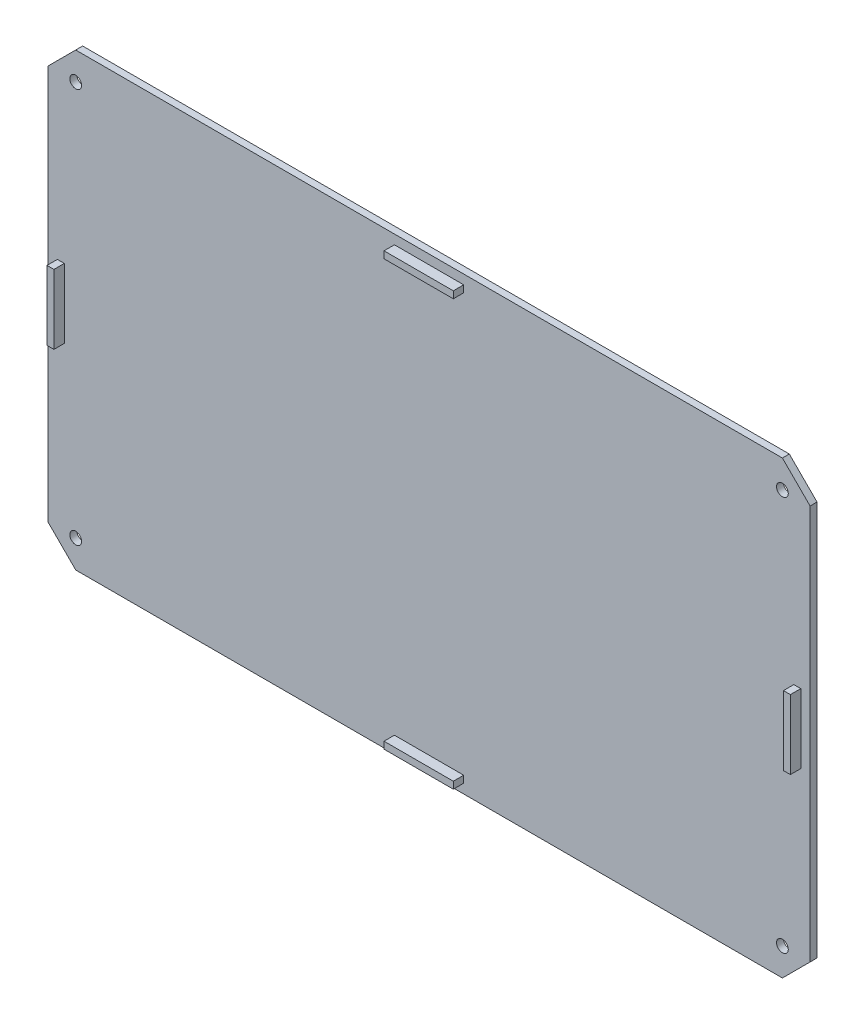
ISO-10303-21;
HEADER;
FILE_DESCRIPTION(('STEP AP214'),'2;1');
FILE_NAME('part.step','',(''),(''),'','','');
FILE_SCHEMA(('AUTOMOTIVE_DESIGN { 1 0 10303 214 1 1 1 1 }'));
ENDSEC;
DATA;
#1=APPLICATION_CONTEXT('core data for automotive mechanical design processes');
#2=APPLICATION_PROTOCOL_DEFINITION('international standard','automotive_design',2000,#1);
#3=PRODUCT_CONTEXT('',#1,'mechanical');
#4=PRODUCT('Part','Part','',(#3));
#5=PRODUCT_RELATED_PRODUCT_CATEGORY('part','',(#4));
#6=PRODUCT_DEFINITION_FORMATION('','',#4);
#7=PRODUCT_DEFINITION_CONTEXT('part definition',#1,'design');
#8=PRODUCT_DEFINITION('design','',#6,#7);
#9=PRODUCT_DEFINITION_SHAPE('','',#8);
#10=(LENGTH_UNIT() NAMED_UNIT(*) SI_UNIT(.MILLI.,.METRE.));
#11=(NAMED_UNIT(*) PLANE_ANGLE_UNIT() SI_UNIT($,.RADIAN.));
#12=(NAMED_UNIT(*) SI_UNIT($,.STERADIAN.) SOLID_ANGLE_UNIT());
#13=UNCERTAINTY_MEASURE_WITH_UNIT(LENGTH_MEASURE(1.E-05),#10,'distance_accuracy_value','');
#14=(GEOMETRIC_REPRESENTATION_CONTEXT(3) GLOBAL_UNCERTAINTY_ASSIGNED_CONTEXT((#13)) GLOBAL_UNIT_ASSIGNED_CONTEXT((#10,
#11,#12)) REPRESENTATION_CONTEXT('',''));
#15=CARTESIAN_POINT('',(0.,0.,0.));
#16=DIRECTION('',(0.,0.,1.));
#17=DIRECTION('',(1.,0.,0.));
#18=AXIS2_PLACEMENT_3D('',#15,#16,#17);
#19=CARTESIAN_POINT('',(0.,0.,2.));
#20=DIRECTION('',(0.,0.,1.));
#21=DIRECTION('',(1.,0.,0.));
#22=AXIS2_PLACEMENT_3D('',#19,#20,#21);
#23=PLANE('',#22);
#24=CARTESIAN_POINT('',(102.,57.,2.));
#25=DIRECTION('',(0.,0.,1.));
#26=DIRECTION('',(1.,0.,0.));
#27=AXIS2_PLACEMENT_3D('',#24,#25,#26);
#28=CIRCLE('',#27,1.7);
#29=CARTESIAN_POINT('',(103.7,57.,2.));
#30=VERTEX_POINT('',#29);
#31=EDGE_CURVE('E381',#30,#30,#28,.F.);
#32=ORIENTED_EDGE('',*,*,#31,.T.);
#33=EDGE_LOOP('',(#32));
#34=FACE_BOUND('',#33,.T.);
#35=CARTESIAN_POINT('',(102.,-57.,2.));
#36=DIRECTION('',(0.,0.,1.));
#37=DIRECTION('',(1.,0.,0.));
#38=AXIS2_PLACEMENT_3D('',#35,#36,#37);
#39=CIRCLE('',#38,1.7);
#40=CARTESIAN_POINT('',(103.7,-57.,2.));
#41=VERTEX_POINT('',#40);
#42=EDGE_CURVE('E378',#41,#41,#39,.F.);
#43=ORIENTED_EDGE('',*,*,#42,.T.);
#44=EDGE_LOOP('',(#43));
#45=FACE_BOUND('',#44,.T.);
#46=CARTESIAN_POINT('',(-102.,57.,2.));
#47=DIRECTION('',(0.,0.,1.));
#48=DIRECTION('',(1.,0.,0.));
#49=AXIS2_PLACEMENT_3D('',#46,#47,#48);
#50=CIRCLE('',#49,1.7);
#51=CARTESIAN_POINT('',(-100.3,57.,2.));
#52=VERTEX_POINT('',#51);
#53=EDGE_CURVE('E375',#52,#52,#50,.F.);
#54=ORIENTED_EDGE('',*,*,#53,.T.);
#55=EDGE_LOOP('',(#54));
#56=FACE_BOUND('',#55,.T.);
#57=CARTESIAN_POINT('',(-102.,-57.,2.));
#58=DIRECTION('',(0.,0.,1.));
#59=DIRECTION('',(1.,0.,0.));
#60=AXIS2_PLACEMENT_3D('',#57,#58,#59);
#61=CIRCLE('',#60,1.7);
#62=CARTESIAN_POINT('',(-100.3,-57.,2.));
#63=VERTEX_POINT('',#62);
#64=EDGE_CURVE('E374',#63,#63,#61,.F.);
#65=ORIENTED_EDGE('',*,*,#64,.T.);
#66=EDGE_LOOP('',(#65));
#67=FACE_BOUND('',#66,.T.);
#68=DIRECTION('',(0.707106781186544,-0.707106781186551,0.));
#69=VECTOR('',#68,1.);
#70=CARTESIAN_POINT('',(-110.,-57.,2.));
#71=LINE('',#70,#69);
#72=CARTESIAN_POINT('',(-110.,-57.,2.));
#73=VERTEX_POINT('',#72);
#74=CARTESIAN_POINT('',(-102.,-65.,2.));
#75=VERTEX_POINT('',#74);
#76=EDGE_CURVE('E318',#73,#75,#71,.T.);
#77=ORIENTED_EDGE('',*,*,#76,.T.);
#78=DIRECTION('',(1.,0.,0.));
#79=VECTOR('',#78,1.);
#80=CARTESIAN_POINT('',(-102.,-65.,2.));
#81=LINE('',#80,#79);
#82=CARTESIAN_POINT('',(102.,-65.,2.));
#83=VERTEX_POINT('',#82);
#84=EDGE_CURVE('E321',#75,#83,#81,.T.);
#85=ORIENTED_EDGE('',*,*,#84,.T.);
#86=DIRECTION('',(0.707106781186546,0.707106781186549,0.));
#87=VECTOR('',#86,1.);
#88=CARTESIAN_POINT('',(102.,-65.,2.));
#89=LINE('',#88,#87);
#90=CARTESIAN_POINT('',(110.,-57.,2.));
#91=VERTEX_POINT('',#90);
#92=EDGE_CURVE('E324',#83,#91,#89,.T.);
#93=ORIENTED_EDGE('',*,*,#92,.T.);
#94=DIRECTION('',(0.,1.,0.));
#95=VECTOR('',#94,1.);
#96=CARTESIAN_POINT('',(110.,-57.,2.));
#97=LINE('',#96,#95);
#98=CARTESIAN_POINT('',(110.,57.,2.));
#99=VERTEX_POINT('',#98);
#100=EDGE_CURVE('E326',#91,#99,#97,.T.);
#101=ORIENTED_EDGE('',*,*,#100,.T.);
#102=DIRECTION('',(-0.707106781186548,0.707106781186547,0.));
#103=VECTOR('',#102,1.);
#104=CARTESIAN_POINT('',(110.,57.,2.));
#105=LINE('',#104,#103);
#106=CARTESIAN_POINT('',(102.,65.,2.));
#107=VERTEX_POINT('',#106);
#108=EDGE_CURVE('E328',#99,#107,#105,.T.);
#109=ORIENTED_EDGE('',*,*,#108,.T.);
#110=DIRECTION('',(-1.,0.,0.));
#111=VECTOR('',#110,1.);
#112=CARTESIAN_POINT('',(102.,65.,2.));
#113=LINE('',#112,#111);
#114=CARTESIAN_POINT('',(-102.,65.,2.));
#115=VERTEX_POINT('',#114);
#116=EDGE_CURVE('E330',#107,#115,#113,.T.);
#117=ORIENTED_EDGE('',*,*,#116,.T.);
#118=DIRECTION('',(-0.707106781186547,-0.707106781186548,0.));
#119=VECTOR('',#118,1.);
#120=CARTESIAN_POINT('',(-102.,65.,2.));
#121=LINE('',#120,#119);
#122=CARTESIAN_POINT('',(-110.,57.,2.));
#123=VERTEX_POINT('',#122);
#124=EDGE_CURVE('E332',#115,#123,#121,.T.);
#125=ORIENTED_EDGE('',*,*,#124,.T.);
#126=DIRECTION('',(0.,-1.,0.));
#127=VECTOR('',#126,1.);
#128=CARTESIAN_POINT('',(-110.,57.,2.));
#129=LINE('',#128,#127);
#130=EDGE_CURVE('E334',#123,#73,#129,.T.);
#131=ORIENTED_EDGE('',*,*,#130,.T.);
#132=EDGE_LOOP('',(#77,#85,#93,#101,#109,#117,#125,#131));
#133=FACE_BOUND('',#132,.T.);
#134=DIRECTION('',(1.,0.,0.));
#135=VECTOR('',#134,1.);
#136=CARTESIAN_POINT('',(-10.,-62.3,2.));
#137=LINE('',#136,#135);
#138=CARTESIAN_POINT('',(-10.,-62.3,2.));
#139=VERTEX_POINT('',#138);
#140=CARTESIAN_POINT('',(10.,-62.3,2.));
#141=VERTEX_POINT('',#140);
#142=EDGE_CURVE('E302',#139,#141,#137,.T.);
#143=ORIENTED_EDGE('',*,*,#142,.F.);
#144=DIRECTION('',(0.,-1.,0.));
#145=VECTOR('',#144,1.);
#146=CARTESIAN_POINT('',(-10.,-62.3,2.));
#147=LINE('',#146,#145);
#148=CARTESIAN_POINT('',(-10.,-60.3,2.));
#149=VERTEX_POINT('',#148);
#150=EDGE_CURVE('E288',#149,#139,#147,.T.);
#151=ORIENTED_EDGE('',*,*,#150,.F.);
#152=DIRECTION('',(-1.,0.,0.));
#153=VECTOR('',#152,1.);
#154=CARTESIAN_POINT('',(-10.,-60.3,2.));
#155=LINE('',#154,#153);
#156=CARTESIAN_POINT('',(10.,-60.3,2.));
#157=VERTEX_POINT('',#156);
#158=EDGE_CURVE('E293',#157,#149,#155,.T.);
#159=ORIENTED_EDGE('',*,*,#158,.F.);
#160=DIRECTION('',(0.,1.,0.));
#161=VECTOR('',#160,1.);
#162=CARTESIAN_POINT('',(10.,-62.3,2.));
#163=LINE('',#162,#161);
#164=EDGE_CURVE('E304',#141,#157,#163,.T.);
#165=ORIENTED_EDGE('',*,*,#164,.F.);
#166=EDGE_LOOP('',(#143,#151,#159,#165));
#167=FACE_BOUND('',#166,.T.);
#168=DIRECTION('',(1.,0.,0.));
#169=VECTOR('',#168,1.);
#170=CARTESIAN_POINT('',(-107.3,-10.,2.));
#171=LINE('',#170,#169);
#172=CARTESIAN_POINT('',(-107.3,-10.,2.));
#173=VERTEX_POINT('',#172);
#174=CARTESIAN_POINT('',(-105.3,-10.,2.));
#175=VERTEX_POINT('',#174);
#176=EDGE_CURVE('E273',#173,#175,#171,.T.);
#177=ORIENTED_EDGE('',*,*,#176,.F.);
#178=DIRECTION('',(0.,-1.,0.));
#179=VECTOR('',#178,1.);
#180=CARTESIAN_POINT('',(-107.3,-10.,2.));
#181=LINE('',#180,#179);
#182=CARTESIAN_POINT('',(-107.3,10.,2.));
#183=VERTEX_POINT('',#182);
#184=EDGE_CURVE('E259',#183,#173,#181,.T.);
#185=ORIENTED_EDGE('',*,*,#184,.F.);
#186=DIRECTION('',(-1.,0.,0.));
#187=VECTOR('',#186,1.);
#188=CARTESIAN_POINT('',(-107.3,10.,2.));
#189=LINE('',#188,#187);
#190=CARTESIAN_POINT('',(-105.3,10.,2.));
#191=VERTEX_POINT('',#190);
#192=EDGE_CURVE('E264',#191,#183,#189,.T.);
#193=ORIENTED_EDGE('',*,*,#192,.F.);
#194=DIRECTION('',(0.,1.,0.));
#195=VECTOR('',#194,1.);
#196=CARTESIAN_POINT('',(-105.3,-10.,2.));
#197=LINE('',#196,#195);
#198=EDGE_CURVE('E275',#175,#191,#197,.T.);
#199=ORIENTED_EDGE('',*,*,#198,.F.);
#200=EDGE_LOOP('',(#177,#185,#193,#199));
#201=FACE_BOUND('',#200,.T.);
#202=DIRECTION('',(1.,0.,0.));
#203=VECTOR('',#202,1.);
#204=CARTESIAN_POINT('',(-10.,60.3,2.));
#205=LINE('',#204,#203);
#206=CARTESIAN_POINT('',(-10.,60.3,2.));
#207=VERTEX_POINT('',#206);
#208=CARTESIAN_POINT('',(10.,60.3,2.));
#209=VERTEX_POINT('',#208);
#210=EDGE_CURVE('E231',#207,#209,#205,.T.);
#211=ORIENTED_EDGE('',*,*,#210,.F.);
#212=DIRECTION('',(0.,-1.,0.));
#213=VECTOR('',#212,1.);
#214=CARTESIAN_POINT('',(-10.,60.3,2.));
#215=LINE('',#214,#213);
#216=CARTESIAN_POINT('',(-10.,62.3,2.));
#217=VERTEX_POINT('',#216);
#218=EDGE_CURVE('E228',#217,#207,#215,.T.);
#219=ORIENTED_EDGE('',*,*,#218,.F.);
#220=DIRECTION('',(-1.,0.,0.));
#221=VECTOR('',#220,1.);
#222=CARTESIAN_POINT('',(-10.,62.3,2.));
#223=LINE('',#222,#221);
#224=CARTESIAN_POINT('',(10.,62.3,2.));
#225=VERTEX_POINT('',#224);
#226=EDGE_CURVE('E240',#225,#217,#223,.T.);
#227=ORIENTED_EDGE('',*,*,#226,.F.);
#228=DIRECTION('',(0.,1.,0.));
#229=VECTOR('',#228,1.);
#230=CARTESIAN_POINT('',(10.,60.3,2.));
#231=LINE('',#230,#229);
#232=EDGE_CURVE('E248',#209,#225,#231,.T.);
#233=ORIENTED_EDGE('',*,*,#232,.F.);
#234=EDGE_LOOP('',(#211,#219,#227,#233));
#235=FACE_BOUND('',#234,.T.);
#236=DIRECTION('',(1.,0.,0.));
#237=VECTOR('',#236,1.);
#238=CARTESIAN_POINT('',(105.3,-10.,2.));
#239=LINE('',#238,#237);
#240=CARTESIAN_POINT('',(105.3,-10.,2.));
#241=VERTEX_POINT('',#240);
#242=CARTESIAN_POINT('',(107.3,-10.,2.));
#243=VERTEX_POINT('',#242);
#244=EDGE_CURVE('E400',#241,#243,#239,.T.);
#245=ORIENTED_EDGE('',*,*,#244,.F.);
#246=DIRECTION('',(0.,-1.,0.));
#247=VECTOR('',#246,1.);
#248=CARTESIAN_POINT('',(105.3,-10.,2.));
#249=LINE('',#248,#247);
#250=CARTESIAN_POINT('',(105.3,10.,2.));
#251=VERTEX_POINT('',#250);
#252=EDGE_CURVE('E226',#251,#241,#249,.T.);
#253=ORIENTED_EDGE('',*,*,#252,.F.);
#254=DIRECTION('',(-1.,0.,0.));
#255=VECTOR('',#254,1.);
#256=CARTESIAN_POINT('',(105.3,10.,2.));
#257=LINE('',#256,#255);
#258=CARTESIAN_POINT('',(107.3,10.,2.));
#259=VERTEX_POINT('',#258);
#260=EDGE_CURVE('E222',#259,#251,#257,.T.);
#261=ORIENTED_EDGE('',*,*,#260,.F.);
#262=DIRECTION('',(0.,1.,0.));
#263=VECTOR('',#262,1.);
#264=CARTESIAN_POINT('',(107.3,-10.,2.));
#265=LINE('',#264,#263);
#266=EDGE_CURVE('E402',#243,#259,#265,.T.);
#267=ORIENTED_EDGE('',*,*,#266,.F.);
#268=EDGE_LOOP('',(#245,#253,#261,#267));
#269=FACE_BOUND('',#268,.T.);
#270=ADVANCED_FACE('F39',(#34,#45,#56,#67,#133,#167,#201,#235,#269),#23,.T.);
#271=CARTESIAN_POINT('',(-110.,-57.,2.));
#272=DIRECTION('',(0.707106781186551,0.707106781186544,0.));
#273=DIRECTION('',(-0.707106781186544,0.707106781186551,0.));
#274=AXIS2_PLACEMENT_3D('',#271,#272,#273);
#275=PLANE('',#274);
#276=DIRECTION('',(0.707106781186544,-0.707106781186551,0.));
#277=VECTOR('',#276,1.);
#278=CARTESIAN_POINT('',(-110.,-57.,0.));
#279=LINE('',#278,#277);
#280=CARTESIAN_POINT('',(-110.,-57.,0.));
#281=VERTEX_POINT('',#280);
#282=CARTESIAN_POINT('',(-102.,-65.,0.));
#283=VERTEX_POINT('',#282);
#284=EDGE_CURVE('E317',#281,#283,#279,.T.);
#285=ORIENTED_EDGE('',*,*,#284,.T.);
#286=DIRECTION('',(0.,0.,-1.));
#287=VECTOR('',#286,1.);
#288=CARTESIAN_POINT('',(-102.,-65.,2.));
#289=LINE('',#288,#287);
#290=EDGE_CURVE('E11',#75,#283,#289,.T.);
#291=ORIENTED_EDGE('',*,*,#290,.F.);
#292=ORIENTED_EDGE('',*,*,#76,.F.);
#293=DIRECTION('',(0.,0.,-1.));
#294=VECTOR('',#293,1.);
#295=CARTESIAN_POINT('',(-110.,-57.,2.));
#296=LINE('',#295,#294);
#297=EDGE_CURVE('E336',#73,#281,#296,.T.);
#298=ORIENTED_EDGE('',*,*,#297,.T.);
#299=EDGE_LOOP('',(#285,#291,#292,#298));
#300=FACE_BOUND('',#299,.T.);
#301=ADVANCED_FACE('F41',(#300),#275,.F.);
#302=CARTESIAN_POINT('',(-102.,-65.,2.));
#303=DIRECTION('',(0.,1.,0.));
#304=DIRECTION('',(0.,0.,1.));
#305=AXIS2_PLACEMENT_3D('',#302,#303,#304);
#306=PLANE('',#305);
#307=DIRECTION('',(1.,0.,0.));
#308=VECTOR('',#307,1.);
#309=CARTESIAN_POINT('',(-102.,-65.,0.));
#310=LINE('',#309,#308);
#311=CARTESIAN_POINT('',(102.,-65.,0.));
#312=VERTEX_POINT('',#311);
#313=EDGE_CURVE('E339',#283,#312,#310,.T.);
#314=ORIENTED_EDGE('',*,*,#313,.T.);
#315=DIRECTION('',(0.,0.,-1.));
#316=VECTOR('',#315,1.);
#317=CARTESIAN_POINT('',(102.,-65.,2.));
#318=LINE('',#317,#316);
#319=EDGE_CURVE('E48',#83,#312,#318,.T.);
#320=ORIENTED_EDGE('',*,*,#319,.F.);
#321=ORIENTED_EDGE('',*,*,#84,.F.);
#322=ORIENTED_EDGE('',*,*,#290,.T.);
#323=EDGE_LOOP('',(#314,#320,#321,#322));
#324=FACE_BOUND('',#323,.T.);
#325=ADVANCED_FACE('F427',(#324),#306,.F.);
#326=CARTESIAN_POINT('',(102.,-65.,2.));
#327=DIRECTION('',(-0.707106781186549,0.707106781186546,0.));
#328=DIRECTION('',(-0.707106781186546,-0.707106781186549,0.));
#329=AXIS2_PLACEMENT_3D('',#326,#327,#328);
#330=PLANE('',#329);
#331=DIRECTION('',(0.707106781186546,0.707106781186549,0.));
#332=VECTOR('',#331,1.);
#333=CARTESIAN_POINT('',(102.,-65.,0.));
#334=LINE('',#333,#332);
#335=CARTESIAN_POINT('',(110.,-57.,0.));
#336=VERTEX_POINT('',#335);
#337=EDGE_CURVE('E341',#312,#336,#334,.T.);
#338=ORIENTED_EDGE('',*,*,#337,.T.);
#339=DIRECTION('',(0.,0.,-1.));
#340=VECTOR('',#339,1.);
#341=CARTESIAN_POINT('',(110.,-57.,2.));
#342=LINE('',#341,#340);
#343=EDGE_CURVE('E366',#91,#336,#342,.T.);
#344=ORIENTED_EDGE('',*,*,#343,.F.);
#345=ORIENTED_EDGE('',*,*,#92,.F.);
#346=ORIENTED_EDGE('',*,*,#319,.T.);
#347=EDGE_LOOP('',(#338,#344,#345,#346));
#348=FACE_BOUND('',#347,.T.);
#349=ADVANCED_FACE('F456',(#348),#330,.F.);
#350=CARTESIAN_POINT('',(110.,-57.,2.));
#351=DIRECTION('',(-1.,0.,0.));
#352=DIRECTION('',(0.,0.,1.));
#353=AXIS2_PLACEMENT_3D('',#350,#351,#352);
#354=PLANE('',#353);
#355=DIRECTION('',(0.,1.,0.));
#356=VECTOR('',#355,1.);
#357=CARTESIAN_POINT('',(110.,-57.,0.));
#358=LINE('',#357,#356);
#359=CARTESIAN_POINT('',(110.,57.,0.));
#360=VERTEX_POINT('',#359);
#361=EDGE_CURVE('E343',#336,#360,#358,.T.);
#362=ORIENTED_EDGE('',*,*,#361,.T.);
#363=DIRECTION('',(0.,0.,-1.));
#364=VECTOR('',#363,1.);
#365=CARTESIAN_POINT('',(110.,57.,2.));
#366=LINE('',#365,#364);
#367=EDGE_CURVE('E363',#99,#360,#366,.T.);
#368=ORIENTED_EDGE('',*,*,#367,.F.);
#369=ORIENTED_EDGE('',*,*,#100,.F.);
#370=ORIENTED_EDGE('',*,*,#343,.T.);
#371=EDGE_LOOP('',(#362,#368,#369,#370));
#372=FACE_BOUND('',#371,.T.);
#373=ADVANCED_FACE('F452',(#372),#354,.F.);
#374=CARTESIAN_POINT('',(110.,57.,2.));
#375=DIRECTION('',(-0.707106781186547,-0.707106781186548,0.));
#376=DIRECTION('',(0.707106781186548,-0.707106781186547,0.));
#377=AXIS2_PLACEMENT_3D('',#374,#375,#376);
#378=PLANE('',#377);
#379=DIRECTION('',(-0.707106781186548,0.707106781186547,0.));
#380=VECTOR('',#379,1.);
#381=CARTESIAN_POINT('',(110.,57.,0.));
#382=LINE('',#381,#380);
#383=CARTESIAN_POINT('',(102.,65.,0.));
#384=VERTEX_POINT('',#383);
#385=EDGE_CURVE('E345',#360,#384,#382,.T.);
#386=ORIENTED_EDGE('',*,*,#385,.T.);
#387=DIRECTION('',(0.,0.,-1.));
#388=VECTOR('',#387,1.);
#389=CARTESIAN_POINT('',(102.,65.,2.));
#390=LINE('',#389,#388);
#391=EDGE_CURVE('E360',#107,#384,#390,.T.);
#392=ORIENTED_EDGE('',*,*,#391,.F.);
#393=ORIENTED_EDGE('',*,*,#108,.F.);
#394=ORIENTED_EDGE('',*,*,#367,.T.);
#395=EDGE_LOOP('',(#386,#392,#393,#394));
#396=FACE_BOUND('',#395,.T.);
#397=ADVANCED_FACE('F448',(#396),#378,.F.);
#398=CARTESIAN_POINT('',(102.,65.,2.));
#399=DIRECTION('',(0.,-1.,0.));
#400=DIRECTION('',(0.,0.,-1.));
#401=AXIS2_PLACEMENT_3D('',#398,#399,#400);
#402=PLANE('',#401);
#403=DIRECTION('',(-1.,0.,0.));
#404=VECTOR('',#403,1.);
#405=CARTESIAN_POINT('',(102.,65.,0.));
#406=LINE('',#405,#404);
#407=CARTESIAN_POINT('',(-102.,65.,0.));
#408=VERTEX_POINT('',#407);
#409=EDGE_CURVE('E347',#384,#408,#406,.T.);
#410=ORIENTED_EDGE('',*,*,#409,.T.);
#411=DIRECTION('',(0.,0.,-1.));
#412=VECTOR('',#411,1.);
#413=CARTESIAN_POINT('',(-102.,65.,2.));
#414=LINE('',#413,#412);
#415=EDGE_CURVE('E357',#115,#408,#414,.T.);
#416=ORIENTED_EDGE('',*,*,#415,.F.);
#417=ORIENTED_EDGE('',*,*,#116,.F.);
#418=ORIENTED_EDGE('',*,*,#391,.T.);
#419=EDGE_LOOP('',(#410,#416,#417,#418));
#420=FACE_BOUND('',#419,.T.);
#421=ADVANCED_FACE('F444',(#420),#402,.F.);
#422=CARTESIAN_POINT('',(-102.,65.,2.));
#423=DIRECTION('',(0.707106781186548,-0.707106781186547,0.));
#424=DIRECTION('',(0.707106781186547,0.707106781186548,0.));
#425=AXIS2_PLACEMENT_3D('',#422,#423,#424);
#426=PLANE('',#425);
#427=DIRECTION('',(-0.707106781186547,-0.707106781186548,0.));
#428=VECTOR('',#427,1.);
#429=CARTESIAN_POINT('',(-102.,65.,0.));
#430=LINE('',#429,#428);
#431=CARTESIAN_POINT('',(-110.,57.,0.));
#432=VERTEX_POINT('',#431);
#433=EDGE_CURVE('E349',#408,#432,#430,.T.);
#434=ORIENTED_EDGE('',*,*,#433,.T.);
#435=DIRECTION('',(0.,0.,-1.));
#436=VECTOR('',#435,1.);
#437=CARTESIAN_POINT('',(-110.,57.,2.));
#438=LINE('',#437,#436);
#439=EDGE_CURVE('E354',#123,#432,#438,.T.);
#440=ORIENTED_EDGE('',*,*,#439,.F.);
#441=ORIENTED_EDGE('',*,*,#124,.F.);
#442=ORIENTED_EDGE('',*,*,#415,.T.);
#443=EDGE_LOOP('',(#434,#440,#441,#442));
#444=FACE_BOUND('',#443,.T.);
#445=ADVANCED_FACE('F440',(#444),#426,.F.);
#446=CARTESIAN_POINT('',(-110.,57.,2.));
#447=DIRECTION('',(1.,0.,0.));
#448=DIRECTION('',(0.,0.,-1.));
#449=AXIS2_PLACEMENT_3D('',#446,#447,#448);
#450=PLANE('',#449);
#451=DIRECTION('',(0.,-1.,0.));
#452=VECTOR('',#451,1.);
#453=CARTESIAN_POINT('',(-110.,57.,0.));
#454=LINE('',#453,#452);
#455=EDGE_CURVE('E322',#432,#281,#454,.T.);
#456=ORIENTED_EDGE('',*,*,#455,.T.);
#457=ORIENTED_EDGE('',*,*,#297,.F.);
#458=ORIENTED_EDGE('',*,*,#130,.F.);
#459=ORIENTED_EDGE('',*,*,#439,.T.);
#460=EDGE_LOOP('',(#456,#457,#458,#459));
#461=FACE_BOUND('',#460,.T.);
#462=ADVANCED_FACE('F436',(#461),#450,.F.);
#463=CARTESIAN_POINT('',(0.,0.,0.));
#464=DIRECTION('',(0.,0.,1.));
#465=DIRECTION('',(1.,0.,0.));
#466=AXIS2_PLACEMENT_3D('',#463,#464,#465);
#467=PLANE('',#466);
#468=CARTESIAN_POINT('',(102.,57.,0.));
#469=DIRECTION('',(0.,0.,1.));
#470=DIRECTION('',(1.,0.,0.));
#471=AXIS2_PLACEMENT_3D('',#468,#469,#470);
#472=CIRCLE('',#471,1.7);
#473=CARTESIAN_POINT('',(103.7,57.,0.));
#474=VERTEX_POINT('',#473);
#475=EDGE_CURVE('E43',#474,#474,#472,.F.);
#476=ORIENTED_EDGE('',*,*,#475,.F.);
#477=EDGE_LOOP('',(#476));
#478=FACE_BOUND('',#477,.T.);
#479=CARTESIAN_POINT('',(102.,-57.,0.));
#480=DIRECTION('',(0.,0.,1.));
#481=DIRECTION('',(1.,0.,0.));
#482=AXIS2_PLACEMENT_3D('',#479,#480,#481);
#483=CIRCLE('',#482,1.7);
#484=CARTESIAN_POINT('',(103.7,-57.,0.));
#485=VERTEX_POINT('',#484);
#486=EDGE_CURVE('E379',#485,#485,#483,.F.);
#487=ORIENTED_EDGE('',*,*,#486,.F.);
#488=EDGE_LOOP('',(#487));
#489=FACE_BOUND('',#488,.T.);
#490=CARTESIAN_POINT('',(-102.,57.,0.));
#491=DIRECTION('',(0.,0.,1.));
#492=DIRECTION('',(1.,0.,0.));
#493=AXIS2_PLACEMENT_3D('',#490,#491,#492);
#494=CIRCLE('',#493,1.7);
#495=CARTESIAN_POINT('',(-100.3,57.,0.));
#496=VERTEX_POINT('',#495);
#497=EDGE_CURVE('E376',#496,#496,#494,.F.);
#498=ORIENTED_EDGE('',*,*,#497,.F.);
#499=EDGE_LOOP('',(#498));
#500=FACE_BOUND('',#499,.T.);
#501=CARTESIAN_POINT('',(-102.,-57.,0.));
#502=DIRECTION('',(0.,0.,1.));
#503=DIRECTION('',(1.,0.,0.));
#504=AXIS2_PLACEMENT_3D('',#501,#502,#503);
#505=CIRCLE('',#504,1.7);
#506=CARTESIAN_POINT('',(-100.3,-57.,0.));
#507=VERTEX_POINT('',#506);
#508=EDGE_CURVE('E371',#507,#507,#505,.F.);
#509=ORIENTED_EDGE('',*,*,#508,.F.);
#510=EDGE_LOOP('',(#509));
#511=FACE_BOUND('',#510,.T.);
#512=ORIENTED_EDGE('',*,*,#284,.F.);
#513=ORIENTED_EDGE('',*,*,#455,.F.);
#514=ORIENTED_EDGE('',*,*,#433,.F.);
#515=ORIENTED_EDGE('',*,*,#409,.F.);
#516=ORIENTED_EDGE('',*,*,#385,.F.);
#517=ORIENTED_EDGE('',*,*,#361,.F.);
#518=ORIENTED_EDGE('',*,*,#337,.F.);
#519=ORIENTED_EDGE('',*,*,#313,.F.);
#520=EDGE_LOOP('',(#512,#513,#514,#515,#516,#517,#518,#519));
#521=FACE_BOUND('',#520,.T.);
#522=ADVANCED_FACE('F434',(#478,#489,#500,#511,#521),#467,.F.);
#523=CARTESIAN_POINT('',(-10.,-62.3,5.));
#524=DIRECTION('',(1.,0.,0.));
#525=DIRECTION('',(0.,0.,-1.));
#526=AXIS2_PLACEMENT_3D('',#523,#524,#525);
#527=PLANE('',#526);
#528=ORIENTED_EDGE('',*,*,#150,.T.);
#529=DIRECTION('',(0.,0.,-1.));
#530=VECTOR('',#529,1.);
#531=CARTESIAN_POINT('',(-10.,-62.3,5.));
#532=LINE('',#531,#530);
#533=CARTESIAN_POINT('',(-10.,-62.3,5.));
#534=VERTEX_POINT('',#533);
#535=EDGE_CURVE('E315',#534,#139,#532,.T.);
#536=ORIENTED_EDGE('',*,*,#535,.F.);
#537=DIRECTION('',(0.,-1.,0.));
#538=VECTOR('',#537,1.);
#539=CARTESIAN_POINT('',(-10.,-62.3,5.));
#540=LINE('',#539,#538);
#541=CARTESIAN_POINT('',(-10.,-60.3,5.));
#542=VERTEX_POINT('',#541);
#543=EDGE_CURVE('E289',#542,#534,#540,.T.);
#544=ORIENTED_EDGE('',*,*,#543,.F.);
#545=DIRECTION('',(0.,0.,-1.));
#546=VECTOR('',#545,1.);
#547=CARTESIAN_POINT('',(-10.,-60.3,5.));
#548=LINE('',#547,#546);
#549=EDGE_CURVE('E299',#542,#149,#548,.T.);
#550=ORIENTED_EDGE('',*,*,#549,.T.);
#551=EDGE_LOOP('',(#528,#536,#544,#550));
#552=FACE_BOUND('',#551,.T.);
#553=ADVANCED_FACE('F432',(#552),#527,.F.);
#554=CARTESIAN_POINT('',(-10.,-62.3,5.));
#555=DIRECTION('',(0.,1.,0.));
#556=DIRECTION('',(0.,0.,1.));
#557=AXIS2_PLACEMENT_3D('',#554,#555,#556);
#558=PLANE('',#557);
#559=ORIENTED_EDGE('',*,*,#142,.T.);
#560=DIRECTION('',(0.,0.,-1.));
#561=VECTOR('',#560,1.);
#562=CARTESIAN_POINT('',(10.,-62.3,5.));
#563=LINE('',#562,#561);
#564=CARTESIAN_POINT('',(10.,-62.3,5.));
#565=VERTEX_POINT('',#564);
#566=EDGE_CURVE('E312',#565,#141,#563,.T.);
#567=ORIENTED_EDGE('',*,*,#566,.F.);
#568=DIRECTION('',(1.,0.,0.));
#569=VECTOR('',#568,1.);
#570=CARTESIAN_POINT('',(-10.,-62.3,5.));
#571=LINE('',#570,#569);
#572=EDGE_CURVE('E292',#534,#565,#571,.T.);
#573=ORIENTED_EDGE('',*,*,#572,.F.);
#574=ORIENTED_EDGE('',*,*,#535,.T.);
#575=EDGE_LOOP('',(#559,#567,#573,#574));
#576=FACE_BOUND('',#575,.T.);
#577=ADVANCED_FACE('F559',(#576),#558,.F.);
#578=CARTESIAN_POINT('',(10.,-62.3,5.));
#579=DIRECTION('',(-1.,0.,0.));
#580=DIRECTION('',(0.,0.,1.));
#581=AXIS2_PLACEMENT_3D('',#578,#579,#580);
#582=PLANE('',#581);
#583=ORIENTED_EDGE('',*,*,#164,.T.);
#584=DIRECTION('',(0.,0.,-1.));
#585=VECTOR('',#584,1.);
#586=CARTESIAN_POINT('',(10.,-60.3,5.));
#587=LINE('',#586,#585);
#588=CARTESIAN_POINT('',(10.,-60.3,5.));
#589=VERTEX_POINT('',#588);
#590=EDGE_CURVE('E310',#589,#157,#587,.T.);
#591=ORIENTED_EDGE('',*,*,#590,.F.);
#592=DIRECTION('',(0.,1.,0.));
#593=VECTOR('',#592,1.);
#594=CARTESIAN_POINT('',(10.,-62.3,5.));
#595=LINE('',#594,#593);
#596=EDGE_CURVE('E295',#565,#589,#595,.T.);
#597=ORIENTED_EDGE('',*,*,#596,.F.);
#598=ORIENTED_EDGE('',*,*,#566,.T.);
#599=EDGE_LOOP('',(#583,#591,#597,#598));
#600=FACE_BOUND('',#599,.T.);
#601=ADVANCED_FACE('F556',(#600),#582,.F.);
#602=CARTESIAN_POINT('',(-10.,-60.3,5.));
#603=DIRECTION('',(0.,-1.,0.));
#604=DIRECTION('',(0.,0.,-1.));
#605=AXIS2_PLACEMENT_3D('',#602,#603,#604);
#606=PLANE('',#605);
#607=ORIENTED_EDGE('',*,*,#158,.T.);
#608=ORIENTED_EDGE('',*,*,#549,.F.);
#609=DIRECTION('',(-1.,0.,0.));
#610=VECTOR('',#609,1.);
#611=CARTESIAN_POINT('',(-10.,-60.3,5.));
#612=LINE('',#611,#610);
#613=EDGE_CURVE('E297',#589,#542,#612,.T.);
#614=ORIENTED_EDGE('',*,*,#613,.F.);
#615=ORIENTED_EDGE('',*,*,#590,.T.);
#616=EDGE_LOOP('',(#607,#608,#614,#615));
#617=FACE_BOUND('',#616,.T.);
#618=ADVANCED_FACE('F552',(#617),#606,.F.);
#619=CARTESIAN_POINT('',(0.,0.,5.));
#620=DIRECTION('',(0.,0.,-1.));
#621=DIRECTION('',(-1.,0.,0.));
#622=AXIS2_PLACEMENT_3D('',#619,#620,#621);
#623=PLANE('',#622);
#624=ORIENTED_EDGE('',*,*,#543,.T.);
#625=ORIENTED_EDGE('',*,*,#572,.T.);
#626=ORIENTED_EDGE('',*,*,#596,.T.);
#627=ORIENTED_EDGE('',*,*,#613,.T.);
#628=EDGE_LOOP('',(#624,#625,#626,#627));
#629=FACE_BOUND('',#628,.T.);
#630=ADVANCED_FACE('F548',(#629),#623,.F.);
#631=CARTESIAN_POINT('',(-107.3,-10.,5.));
#632=DIRECTION('',(1.,0.,0.));
#633=DIRECTION('',(0.,0.,-1.));
#634=AXIS2_PLACEMENT_3D('',#631,#632,#633);
#635=PLANE('',#634);
#636=ORIENTED_EDGE('',*,*,#184,.T.);
#637=DIRECTION('',(0.,0.,-1.));
#638=VECTOR('',#637,1.);
#639=CARTESIAN_POINT('',(-107.3,-10.,5.));
#640=LINE('',#639,#638);
#641=CARTESIAN_POINT('',(-107.3,-10.,5.));
#642=VERTEX_POINT('',#641);
#643=EDGE_CURVE('E286',#642,#173,#640,.T.);
#644=ORIENTED_EDGE('',*,*,#643,.F.);
#645=DIRECTION('',(0.,-1.,0.));
#646=VECTOR('',#645,1.);
#647=CARTESIAN_POINT('',(-107.3,-10.,5.));
#648=LINE('',#647,#646);
#649=CARTESIAN_POINT('',(-107.3,10.,5.));
#650=VERTEX_POINT('',#649);
#651=EDGE_CURVE('E260',#650,#642,#648,.T.);
#652=ORIENTED_EDGE('',*,*,#651,.F.);
#653=DIRECTION('',(0.,0.,-1.));
#654=VECTOR('',#653,1.);
#655=CARTESIAN_POINT('',(-107.3,10.,5.));
#656=LINE('',#655,#654);
#657=EDGE_CURVE('E270',#650,#183,#656,.T.);
#658=ORIENTED_EDGE('',*,*,#657,.T.);
#659=EDGE_LOOP('',(#636,#644,#652,#658));
#660=FACE_BOUND('',#659,.T.);
#661=ADVANCED_FACE('F544',(#660),#635,.F.);
#662=CARTESIAN_POINT('',(-107.3,-10.,5.));
#663=DIRECTION('',(0.,1.,0.));
#664=DIRECTION('',(0.,0.,1.));
#665=AXIS2_PLACEMENT_3D('',#662,#663,#664);
#666=PLANE('',#665);
#667=ORIENTED_EDGE('',*,*,#176,.T.);
#668=DIRECTION('',(0.,0.,-1.));
#669=VECTOR('',#668,1.);
#670=CARTESIAN_POINT('',(-105.3,-10.,5.));
#671=LINE('',#670,#669);
#672=CARTESIAN_POINT('',(-105.3,-10.,5.));
#673=VERTEX_POINT('',#672);
#674=EDGE_CURVE('E283',#673,#175,#671,.T.);
#675=ORIENTED_EDGE('',*,*,#674,.F.);
#676=DIRECTION('',(1.,0.,0.));
#677=VECTOR('',#676,1.);
#678=CARTESIAN_POINT('',(-107.3,-10.,5.));
#679=LINE('',#678,#677);
#680=EDGE_CURVE('E263',#642,#673,#679,.T.);
#681=ORIENTED_EDGE('',*,*,#680,.F.);
#682=ORIENTED_EDGE('',*,*,#643,.T.);
#683=EDGE_LOOP('',(#667,#675,#681,#682));
#684=FACE_BOUND('',#683,.T.);
#685=ADVANCED_FACE('F540',(#684),#666,.F.);
#686=CARTESIAN_POINT('',(-105.3,-10.,5.));
#687=DIRECTION('',(-1.,0.,0.));
#688=DIRECTION('',(0.,0.,1.));
#689=AXIS2_PLACEMENT_3D('',#686,#687,#688);
#690=PLANE('',#689);
#691=ORIENTED_EDGE('',*,*,#198,.T.);
#692=DIRECTION('',(0.,0.,-1.));
#693=VECTOR('',#692,1.);
#694=CARTESIAN_POINT('',(-105.3,10.,5.));
#695=LINE('',#694,#693);
#696=CARTESIAN_POINT('',(-105.3,10.,5.));
#697=VERTEX_POINT('',#696);
#698=EDGE_CURVE('E281',#697,#191,#695,.T.);
#699=ORIENTED_EDGE('',*,*,#698,.F.);
#700=DIRECTION('',(0.,1.,0.));
#701=VECTOR('',#700,1.);
#702=CARTESIAN_POINT('',(-105.3,-10.,5.));
#703=LINE('',#702,#701);
#704=EDGE_CURVE('E266',#673,#697,#703,.T.);
#705=ORIENTED_EDGE('',*,*,#704,.F.);
#706=ORIENTED_EDGE('',*,*,#674,.T.);
#707=EDGE_LOOP('',(#691,#699,#705,#706));
#708=FACE_BOUND('',#707,.T.);
#709=ADVANCED_FACE('F536',(#708),#690,.F.);
#710=CARTESIAN_POINT('',(-107.3,10.,5.));
#711=DIRECTION('',(0.,-1.,0.));
#712=DIRECTION('',(0.,0.,-1.));
#713=AXIS2_PLACEMENT_3D('',#710,#711,#712);
#714=PLANE('',#713);
#715=ORIENTED_EDGE('',*,*,#192,.T.);
#716=ORIENTED_EDGE('',*,*,#657,.F.);
#717=DIRECTION('',(-1.,0.,0.));
#718=VECTOR('',#717,1.);
#719=CARTESIAN_POINT('',(-107.3,10.,5.));
#720=LINE('',#719,#718);
#721=EDGE_CURVE('E268',#697,#650,#720,.T.);
#722=ORIENTED_EDGE('',*,*,#721,.F.);
#723=ORIENTED_EDGE('',*,*,#698,.T.);
#724=EDGE_LOOP('',(#715,#716,#722,#723));
#725=FACE_BOUND('',#724,.T.);
#726=ADVANCED_FACE('F532',(#725),#714,.F.);
#727=CARTESIAN_POINT('',(0.,0.,5.));
#728=DIRECTION('',(0.,0.,-1.));
#729=DIRECTION('',(-1.,0.,0.));
#730=AXIS2_PLACEMENT_3D('',#727,#728,#729);
#731=PLANE('',#730);
#732=ORIENTED_EDGE('',*,*,#651,.T.);
#733=ORIENTED_EDGE('',*,*,#680,.T.);
#734=ORIENTED_EDGE('',*,*,#704,.T.);
#735=ORIENTED_EDGE('',*,*,#721,.T.);
#736=EDGE_LOOP('',(#732,#733,#734,#735));
#737=FACE_BOUND('',#736,.T.);
#738=ADVANCED_FACE('F529',(#737),#731,.F.);
#739=CARTESIAN_POINT('',(-10.,60.3,5.));
#740=DIRECTION('',(1.,0.,0.));
#741=DIRECTION('',(0.,0.,-1.));
#742=AXIS2_PLACEMENT_3D('',#739,#740,#741);
#743=PLANE('',#742);
#744=ORIENTED_EDGE('',*,*,#218,.T.);
#745=DIRECTION('',(0.,0.,-1.));
#746=VECTOR('',#745,1.);
#747=CARTESIAN_POINT('',(-10.,60.3,5.));
#748=LINE('',#747,#746);
#749=CARTESIAN_POINT('',(-10.,60.3,5.));
#750=VERTEX_POINT('',#749);
#751=EDGE_CURVE('E257',#750,#207,#748,.T.);
#752=ORIENTED_EDGE('',*,*,#751,.F.);
#753=DIRECTION('',(0.,-1.,0.));
#754=VECTOR('',#753,1.);
#755=CARTESIAN_POINT('',(-10.,60.3,5.));
#756=LINE('',#755,#754);
#757=CARTESIAN_POINT('',(-10.,62.3,5.));
#758=VERTEX_POINT('',#757);
#759=EDGE_CURVE('E236',#758,#750,#756,.T.);
#760=ORIENTED_EDGE('',*,*,#759,.F.);
#761=DIRECTION('',(0.,0.,-1.));
#762=VECTOR('',#761,1.);
#763=CARTESIAN_POINT('',(-10.,62.3,5.));
#764=LINE('',#763,#762);
#765=EDGE_CURVE('E245',#758,#217,#764,.T.);
#766=ORIENTED_EDGE('',*,*,#765,.T.);
#767=EDGE_LOOP('',(#744,#752,#760,#766));
#768=FACE_BOUND('',#767,.T.);
#769=ADVANCED_FACE('F513',(#768),#743,.F.);
#770=CARTESIAN_POINT('',(-10.,60.3,5.));
#771=DIRECTION('',(0.,1.,0.));
#772=DIRECTION('',(0.,0.,1.));
#773=AXIS2_PLACEMENT_3D('',#770,#771,#772);
#774=PLANE('',#773);
#775=ORIENTED_EDGE('',*,*,#210,.T.);
#776=DIRECTION('',(0.,0.,-1.));
#777=VECTOR('',#776,1.);
#778=CARTESIAN_POINT('',(10.,60.3,5.));
#779=LINE('',#778,#777);
#780=CARTESIAN_POINT('',(10.,60.3,5.));
#781=VERTEX_POINT('',#780);
#782=EDGE_CURVE('E254',#781,#209,#779,.T.);
#783=ORIENTED_EDGE('',*,*,#782,.F.);
#784=DIRECTION('',(1.,0.,0.));
#785=VECTOR('',#784,1.);
#786=CARTESIAN_POINT('',(-10.,60.3,5.));
#787=LINE('',#786,#785);
#788=EDGE_CURVE('E239',#750,#781,#787,.T.);
#789=ORIENTED_EDGE('',*,*,#788,.F.);
#790=ORIENTED_EDGE('',*,*,#751,.T.);
#791=EDGE_LOOP('',(#775,#783,#789,#790));
#792=FACE_BOUND('',#791,.T.);
#793=ADVANCED_FACE('F503',(#792),#774,.F.);
#794=CARTESIAN_POINT('',(10.,60.3,5.));
#795=DIRECTION('',(-1.,0.,0.));
#796=DIRECTION('',(0.,0.,1.));
#797=AXIS2_PLACEMENT_3D('',#794,#795,#796);
#798=PLANE('',#797);
#799=ORIENTED_EDGE('',*,*,#232,.T.);
#800=DIRECTION('',(0.,0.,-1.));
#801=VECTOR('',#800,1.);
#802=CARTESIAN_POINT('',(10.,62.3,5.));
#803=LINE('',#802,#801);
#804=CARTESIAN_POINT('',(10.,62.3,5.));
#805=VERTEX_POINT('',#804);
#806=EDGE_CURVE('E64',#805,#225,#803,.T.);
#807=ORIENTED_EDGE('',*,*,#806,.F.);
#808=DIRECTION('',(0.,1.,0.));
#809=VECTOR('',#808,1.);
#810=CARTESIAN_POINT('',(10.,60.3,5.));
#811=LINE('',#810,#809);
#812=EDGE_CURVE('E242',#781,#805,#811,.T.);
#813=ORIENTED_EDGE('',*,*,#812,.F.);
#814=ORIENTED_EDGE('',*,*,#782,.T.);
#815=EDGE_LOOP('',(#799,#807,#813,#814));
#816=FACE_BOUND('',#815,.T.);
#817=ADVANCED_FACE('F507',(#816),#798,.F.);
#818=CARTESIAN_POINT('',(-10.,62.3,5.));
#819=DIRECTION('',(0.,-1.,0.));
#820=DIRECTION('',(0.,0.,-1.));
#821=AXIS2_PLACEMENT_3D('',#818,#819,#820);
#822=PLANE('',#821);
#823=ORIENTED_EDGE('',*,*,#226,.T.);
#824=ORIENTED_EDGE('',*,*,#765,.F.);
#825=DIRECTION('',(-1.,0.,0.));
#826=VECTOR('',#825,1.);
#827=CARTESIAN_POINT('',(-10.,62.3,5.));
#828=LINE('',#827,#826);
#829=EDGE_CURVE('E244',#805,#758,#828,.T.);
#830=ORIENTED_EDGE('',*,*,#829,.F.);
#831=ORIENTED_EDGE('',*,*,#806,.T.);
#832=EDGE_LOOP('',(#823,#824,#830,#831));
#833=FACE_BOUND('',#832,.T.);
#834=ADVANCED_FACE('F514',(#833),#822,.F.);
#835=CARTESIAN_POINT('',(0.,0.,5.));
#836=DIRECTION('',(0.,0.,-1.));
#837=DIRECTION('',(-1.,0.,0.));
#838=AXIS2_PLACEMENT_3D('',#835,#836,#837);
#839=PLANE('',#838);
#840=ORIENTED_EDGE('',*,*,#759,.T.);
#841=ORIENTED_EDGE('',*,*,#788,.T.);
#842=ORIENTED_EDGE('',*,*,#812,.T.);
#843=ORIENTED_EDGE('',*,*,#829,.T.);
#844=EDGE_LOOP('',(#840,#841,#842,#843));
#845=FACE_BOUND('',#844,.T.);
#846=ADVANCED_FACE('F509',(#845),#839,.F.);
#847=CARTESIAN_POINT('',(105.3,-10.,5.));
#848=DIRECTION('',(1.,0.,0.));
#849=DIRECTION('',(0.,0.,-1.));
#850=AXIS2_PLACEMENT_3D('',#847,#848,#849);
#851=PLANE('',#850);
#852=ORIENTED_EDGE('',*,*,#252,.T.);
#853=DIRECTION('',(0.,0.,-1.));
#854=VECTOR('',#853,1.);
#855=CARTESIAN_POINT('',(105.3,-10.,5.));
#856=LINE('',#855,#854);
#857=CARTESIAN_POINT('',(105.3,-10.,5.));
#858=VERTEX_POINT('',#857);
#859=EDGE_CURVE('E207',#858,#241,#856,.T.);
#860=ORIENTED_EDGE('',*,*,#859,.F.);
#861=DIRECTION('',(0.,-1.,0.));
#862=VECTOR('',#861,1.);
#863=CARTESIAN_POINT('',(105.3,-10.,5.));
#864=LINE('',#863,#862);
#865=CARTESIAN_POINT('',(105.3,10.,5.));
#866=VERTEX_POINT('',#865);
#867=EDGE_CURVE('E214',#866,#858,#864,.T.);
#868=ORIENTED_EDGE('',*,*,#867,.F.);
#869=DIRECTION('',(0.,0.,-1.));
#870=VECTOR('',#869,1.);
#871=CARTESIAN_POINT('',(105.3,10.,5.));
#872=LINE('',#871,#870);
#873=EDGE_CURVE('E398',#866,#251,#872,.T.);
#874=ORIENTED_EDGE('',*,*,#873,.T.);
#875=EDGE_LOOP('',(#852,#860,#868,#874));
#876=FACE_BOUND('',#875,.T.);
#877=ADVANCED_FACE('F224',(#876),#851,.F.);
#878=CARTESIAN_POINT('',(105.3,-10.,5.));
#879=DIRECTION('',(0.,1.,0.));
#880=DIRECTION('',(0.,0.,1.));
#881=AXIS2_PLACEMENT_3D('',#878,#879,#880);
#882=PLANE('',#881);
#883=ORIENTED_EDGE('',*,*,#244,.T.);
#884=DIRECTION('',(0.,0.,-1.));
#885=VECTOR('',#884,1.);
#886=CARTESIAN_POINT('',(107.3,-10.,5.));
#887=LINE('',#886,#885);
#888=CARTESIAN_POINT('',(107.3,-10.,5.));
#889=VERTEX_POINT('',#888);
#890=EDGE_CURVE('E210',#889,#243,#887,.T.);
#891=ORIENTED_EDGE('',*,*,#890,.F.);
#892=DIRECTION('',(1.,0.,0.));
#893=VECTOR('',#892,1.);
#894=CARTESIAN_POINT('',(105.3,-10.,5.));
#895=LINE('',#894,#893);
#896=EDGE_CURVE('E203',#858,#889,#895,.T.);
#897=ORIENTED_EDGE('',*,*,#896,.F.);
#898=ORIENTED_EDGE('',*,*,#859,.T.);
#899=EDGE_LOOP('',(#883,#891,#897,#898));
#900=FACE_BOUND('',#899,.T.);
#901=ADVANCED_FACE('F205',(#900),#882,.F.);
#902=CARTESIAN_POINT('',(107.3,-10.,5.));
#903=DIRECTION('',(-1.,0.,0.));
#904=DIRECTION('',(0.,0.,1.));
#905=AXIS2_PLACEMENT_3D('',#902,#903,#904);
#906=PLANE('',#905);
#907=ORIENTED_EDGE('',*,*,#266,.T.);
#908=DIRECTION('',(0.,0.,-1.));
#909=VECTOR('',#908,1.);
#910=CARTESIAN_POINT('',(107.3,10.,5.));
#911=LINE('',#910,#909);
#912=CARTESIAN_POINT('',(107.3,10.,5.));
#913=VERTEX_POINT('',#912);
#914=EDGE_CURVE('E56',#913,#259,#911,.T.);
#915=ORIENTED_EDGE('',*,*,#914,.F.);
#916=DIRECTION('',(0.,1.,0.));
#917=VECTOR('',#916,1.);
#918=CARTESIAN_POINT('',(107.3,-10.,5.));
#919=LINE('',#918,#917);
#920=EDGE_CURVE('E213',#889,#913,#919,.T.);
#921=ORIENTED_EDGE('',*,*,#920,.F.);
#922=ORIENTED_EDGE('',*,*,#890,.T.);
#923=EDGE_LOOP('',(#907,#915,#921,#922));
#924=FACE_BOUND('',#923,.T.);
#925=ADVANCED_FACE('F409',(#924),#906,.F.);
#926=CARTESIAN_POINT('',(105.3,10.,5.));
#927=DIRECTION('',(0.,-1.,0.));
#928=DIRECTION('',(0.,0.,-1.));
#929=AXIS2_PLACEMENT_3D('',#926,#927,#928);
#930=PLANE('',#929);
#931=ORIENTED_EDGE('',*,*,#260,.T.);
#932=ORIENTED_EDGE('',*,*,#873,.F.);
#933=DIRECTION('',(-1.,0.,0.));
#934=VECTOR('',#933,1.);
#935=CARTESIAN_POINT('',(105.3,10.,5.));
#936=LINE('',#935,#934);
#937=EDGE_CURVE('E218',#913,#866,#936,.T.);
#938=ORIENTED_EDGE('',*,*,#937,.F.);
#939=ORIENTED_EDGE('',*,*,#914,.T.);
#940=EDGE_LOOP('',(#931,#932,#938,#939));
#941=FACE_BOUND('',#940,.T.);
#942=ADVANCED_FACE('F410',(#941),#930,.F.);
#943=CARTESIAN_POINT('',(0.,0.,5.));
#944=DIRECTION('',(0.,0.,-1.));
#945=DIRECTION('',(-1.,0.,0.));
#946=AXIS2_PLACEMENT_3D('',#943,#944,#945);
#947=PLANE('',#946);
#948=ORIENTED_EDGE('',*,*,#867,.T.);
#949=ORIENTED_EDGE('',*,*,#896,.T.);
#950=ORIENTED_EDGE('',*,*,#920,.T.);
#951=ORIENTED_EDGE('',*,*,#937,.T.);
#952=EDGE_LOOP('',(#948,#949,#950,#951));
#953=FACE_BOUND('',#952,.T.);
#954=ADVANCED_FACE('F217',(#953),#947,.F.);
#955=CARTESIAN_POINT('',(-102.,-57.,2.1));
#956=DIRECTION('',(0.,0.,-1.));
#957=DIRECTION('',(-1.,0.,0.));
#958=AXIS2_PLACEMENT_3D('',#955,#956,#957);
#959=CYLINDRICAL_SURFACE('',#958,1.7);
#960=ORIENTED_EDGE('',*,*,#64,.F.);
#961=EDGE_LOOP('',(#960));
#962=FACE_BOUND('',#961,.T.);
#963=ORIENTED_EDGE('',*,*,#508,.T.);
#964=EDGE_LOOP('',(#963));
#965=FACE_BOUND('',#964,.T.);
#966=ADVANCED_FACE('F417',(#962,#965),#959,.F.);
#967=CARTESIAN_POINT('',(-102.,57.,2.1));
#968=DIRECTION('',(0.,0.,-1.));
#969=DIRECTION('',(-1.,0.,0.));
#970=AXIS2_PLACEMENT_3D('',#967,#968,#969);
#971=CYLINDRICAL_SURFACE('',#970,1.7);
#972=ORIENTED_EDGE('',*,*,#53,.F.);
#973=EDGE_LOOP('',(#972));
#974=FACE_BOUND('',#973,.T.);
#975=ORIENTED_EDGE('',*,*,#497,.T.);
#976=EDGE_LOOP('',(#975));
#977=FACE_BOUND('',#976,.T.);
#978=ADVANCED_FACE('F736',(#974,#977),#971,.F.);
#979=CARTESIAN_POINT('',(102.,-57.,2.1));
#980=DIRECTION('',(0.,0.,-1.));
#981=DIRECTION('',(-1.,0.,0.));
#982=AXIS2_PLACEMENT_3D('',#979,#980,#981);
#983=CYLINDRICAL_SURFACE('',#982,1.7);
#984=ORIENTED_EDGE('',*,*,#42,.F.);
#985=EDGE_LOOP('',(#984));
#986=FACE_BOUND('',#985,.T.);
#987=ORIENTED_EDGE('',*,*,#486,.T.);
#988=EDGE_LOOP('',(#987));
#989=FACE_BOUND('',#988,.T.);
#990=ADVANCED_FACE('F745',(#986,#989),#983,.F.);
#991=CARTESIAN_POINT('',(102.,57.,2.1));
#992=DIRECTION('',(0.,0.,-1.));
#993=DIRECTION('',(-1.,0.,0.));
#994=AXIS2_PLACEMENT_3D('',#991,#992,#993);
#995=CYLINDRICAL_SURFACE('',#994,1.7);
#996=ORIENTED_EDGE('',*,*,#31,.F.);
#997=EDGE_LOOP('',(#996));
#998=FACE_BOUND('',#997,.T.);
#999=ORIENTED_EDGE('',*,*,#475,.T.);
#1000=EDGE_LOOP('',(#999));
#1001=FACE_BOUND('',#1000,.T.);
#1002=ADVANCED_FACE('F753',(#998,#1001),#995,.F.);
#1003=CLOSED_SHELL('',(#270,#301,#325,#349,#373,#397,#421,#445,#462,#522,#553,#577,#601,#618,
#630,#661,#685,#709,#726,#738,#769,#793,#817,#834,#846,#877,#901,#925,#942,#954,#966,#978,#990,#1002));
#1004=MANIFOLD_SOLID_BREP('B2',#1003);
#1005=ADVANCED_BREP_SHAPE_REPRESENTATION('',(#18,#1004),#14);
#1006=SHAPE_DEFINITION_REPRESENTATION(#9,#1005);
ENDSEC;
END-ISO-10303-21;
